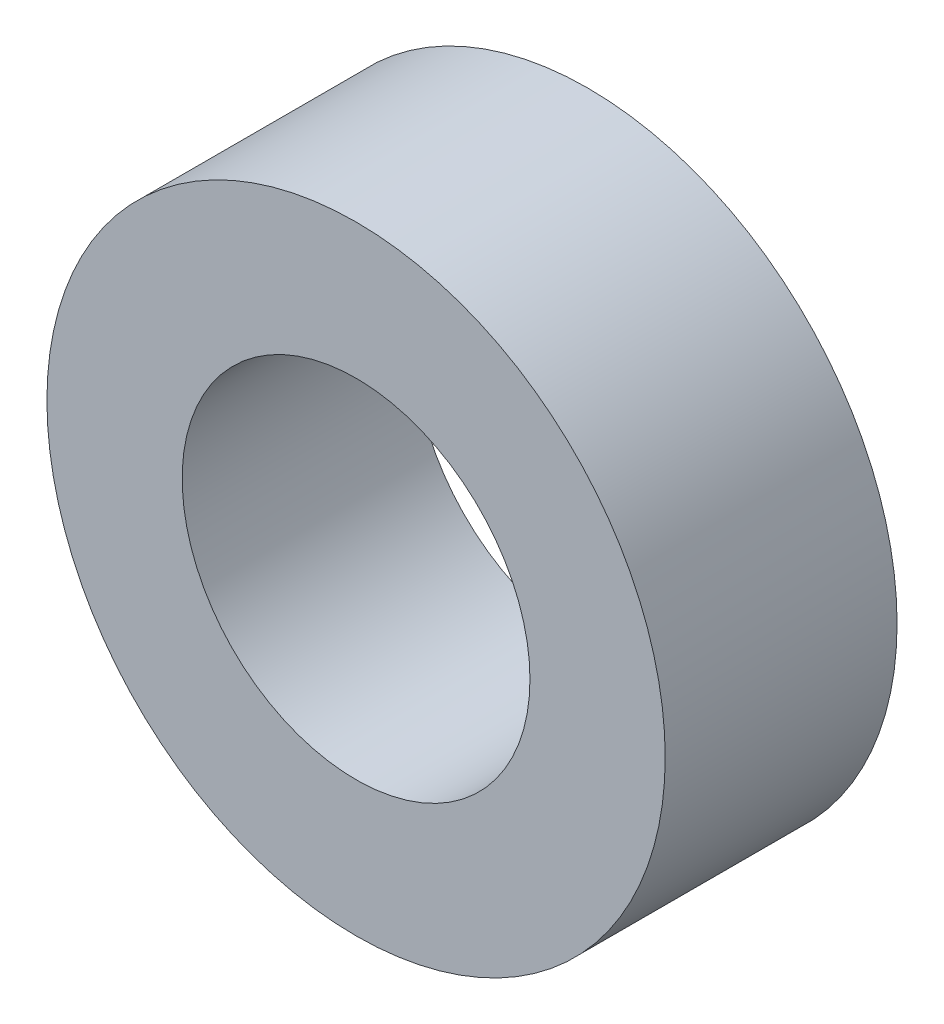
ISO-10303-21;
HEADER;
FILE_DESCRIPTION(('STEP AP214'),'2;1');
FILE_NAME('part.step','',(''),(''),'','','');
FILE_SCHEMA(('AUTOMOTIVE_DESIGN { 1 0 10303 214 1 1 1 1 }'));
ENDSEC;
DATA;
#1=APPLICATION_CONTEXT('core data for automotive mechanical design processes');
#2=APPLICATION_PROTOCOL_DEFINITION('international standard','automotive_design',2000,#1);
#3=PRODUCT_CONTEXT('',#1,'mechanical');
#4=PRODUCT('Part','Part','',(#3));
#5=PRODUCT_RELATED_PRODUCT_CATEGORY('part','',(#4));
#6=PRODUCT_DEFINITION_FORMATION('','',#4);
#7=PRODUCT_DEFINITION_CONTEXT('part definition',#1,'design');
#8=PRODUCT_DEFINITION('design','',#6,#7);
#9=PRODUCT_DEFINITION_SHAPE('','',#8);
#10=(LENGTH_UNIT() NAMED_UNIT(*) SI_UNIT(.MILLI.,.METRE.));
#11=(NAMED_UNIT(*) PLANE_ANGLE_UNIT() SI_UNIT($,.RADIAN.));
#12=(NAMED_UNIT(*) SI_UNIT($,.STERADIAN.) SOLID_ANGLE_UNIT());
#13=UNCERTAINTY_MEASURE_WITH_UNIT(LENGTH_MEASURE(1.E-05),#10,'distance_accuracy_value','');
#14=(GEOMETRIC_REPRESENTATION_CONTEXT(3) GLOBAL_UNCERTAINTY_ASSIGNED_CONTEXT((#13)) GLOBAL_UNIT_ASSIGNED_CONTEXT((#10,
#11,#12)) REPRESENTATION_CONTEXT('',''));
#15=CARTESIAN_POINT('',(0.,0.,0.));
#16=DIRECTION('',(0.,0.,1.));
#17=DIRECTION('',(1.,0.,0.));
#18=AXIS2_PLACEMENT_3D('',#15,#16,#17);
#19=CARTESIAN_POINT('',(0.,0.,3.));
#20=DIRECTION('',(0.,0.,1.));
#21=DIRECTION('',(1.,0.,0.));
#22=AXIS2_PLACEMENT_3D('',#19,#20,#21);
#23=PLANE('',#22);
#24=CARTESIAN_POINT('',(0.,0.,3.));
#25=DIRECTION('',(0.,0.,1.));
#26=DIRECTION('',(1.,0.,0.));
#27=AXIS2_PLACEMENT_3D('',#24,#25,#26);
#28=CIRCLE('',#27,4.);
#29=CARTESIAN_POINT('',(4.,0.,3.));
#30=VERTEX_POINT('',#29);
#31=EDGE_CURVE('E10',#30,#30,#28,.T.);
#32=ORIENTED_EDGE('',*,*,#31,.T.);
#33=EDGE_LOOP('',(#32));
#34=FACE_BOUND('',#33,.T.);
#35=CARTESIAN_POINT('',(0.,0.,3.));
#36=DIRECTION('',(0.,0.,1.));
#37=DIRECTION('',(1.,0.,0.));
#38=AXIS2_PLACEMENT_3D('',#35,#36,#37);
#39=CIRCLE('',#38,2.25);
#40=CARTESIAN_POINT('',(2.25,0.,3.));
#41=VERTEX_POINT('',#40);
#42=EDGE_CURVE('E50',#41,#41,#39,.T.);
#43=ORIENTED_EDGE('',*,*,#42,.F.);
#44=EDGE_LOOP('',(#43));
#45=FACE_BOUND('',#44,.T.);
#46=ADVANCED_FACE('F37',(#34,#45),#23,.T.);
#47=CARTESIAN_POINT('',(0.,0.,0.));
#48=DIRECTION('',(0.,0.,1.));
#49=DIRECTION('',(1.,0.,0.));
#50=AXIS2_PLACEMENT_3D('',#47,#48,#49);
#51=PLANE('',#50);
#52=CARTESIAN_POINT('',(0.,0.,0.));
#53=DIRECTION('',(0.,0.,1.));
#54=DIRECTION('',(1.,0.,0.));
#55=AXIS2_PLACEMENT_3D('',#52,#53,#54);
#56=CIRCLE('',#55,4.);
#57=CARTESIAN_POINT('',(4.,0.,0.));
#58=VERTEX_POINT('',#57);
#59=EDGE_CURVE('E41',#58,#58,#56,.T.);
#60=ORIENTED_EDGE('',*,*,#59,.F.);
#61=EDGE_LOOP('',(#60));
#62=FACE_BOUND('',#61,.T.);
#63=CARTESIAN_POINT('',(0.,0.,0.));
#64=DIRECTION('',(0.,0.,1.));
#65=DIRECTION('',(1.,0.,0.));
#66=AXIS2_PLACEMENT_3D('',#63,#64,#65);
#67=CIRCLE('',#66,2.25);
#68=CARTESIAN_POINT('',(2.25,0.,0.));
#69=VERTEX_POINT('',#68);
#70=EDGE_CURVE('E52',#69,#69,#67,.T.);
#71=ORIENTED_EDGE('',*,*,#70,.T.);
#72=EDGE_LOOP('',(#71));
#73=FACE_BOUND('',#72,.T.);
#74=ADVANCED_FACE('F64',(#62,#73),#51,.F.);
#75=CARTESIAN_POINT('',(0.,0.,3.));
#76=DIRECTION('',(0.,0.,-1.));
#77=DIRECTION('',(-1.,0.,0.));
#78=AXIS2_PLACEMENT_3D('',#75,#76,#77);
#79=CYLINDRICAL_SURFACE('',#78,4.);
#80=ORIENTED_EDGE('',*,*,#31,.F.);
#81=EDGE_LOOP('',(#80));
#82=FACE_BOUND('',#81,.T.);
#83=ORIENTED_EDGE('',*,*,#59,.T.);
#84=EDGE_LOOP('',(#83));
#85=FACE_BOUND('',#84,.T.);
#86=ADVANCED_FACE('F39',(#82,#85),#79,.T.);
#87=CARTESIAN_POINT('',(0.,0.,3.));
#88=DIRECTION('',(0.,0.,-1.));
#89=DIRECTION('',(-1.,0.,0.));
#90=AXIS2_PLACEMENT_3D('',#87,#88,#89);
#91=CYLINDRICAL_SURFACE('',#90,2.25);
#92=ORIENTED_EDGE('',*,*,#42,.T.);
#93=EDGE_LOOP('',(#92));
#94=FACE_BOUND('',#93,.T.);
#95=ORIENTED_EDGE('',*,*,#70,.F.);
#96=EDGE_LOOP('',(#95));
#97=FACE_BOUND('',#96,.T.);
#98=ADVANCED_FACE('F60',(#94,#97),#91,.F.);
#99=CLOSED_SHELL('',(#46,#74,#86,#98));
#100=MANIFOLD_SOLID_BREP('B2',#99);
#101=ADVANCED_BREP_SHAPE_REPRESENTATION('',(#18,#100),#14);
#102=SHAPE_DEFINITION_REPRESENTATION(#9,#101);
ENDSEC;
END-ISO-10303-21;
